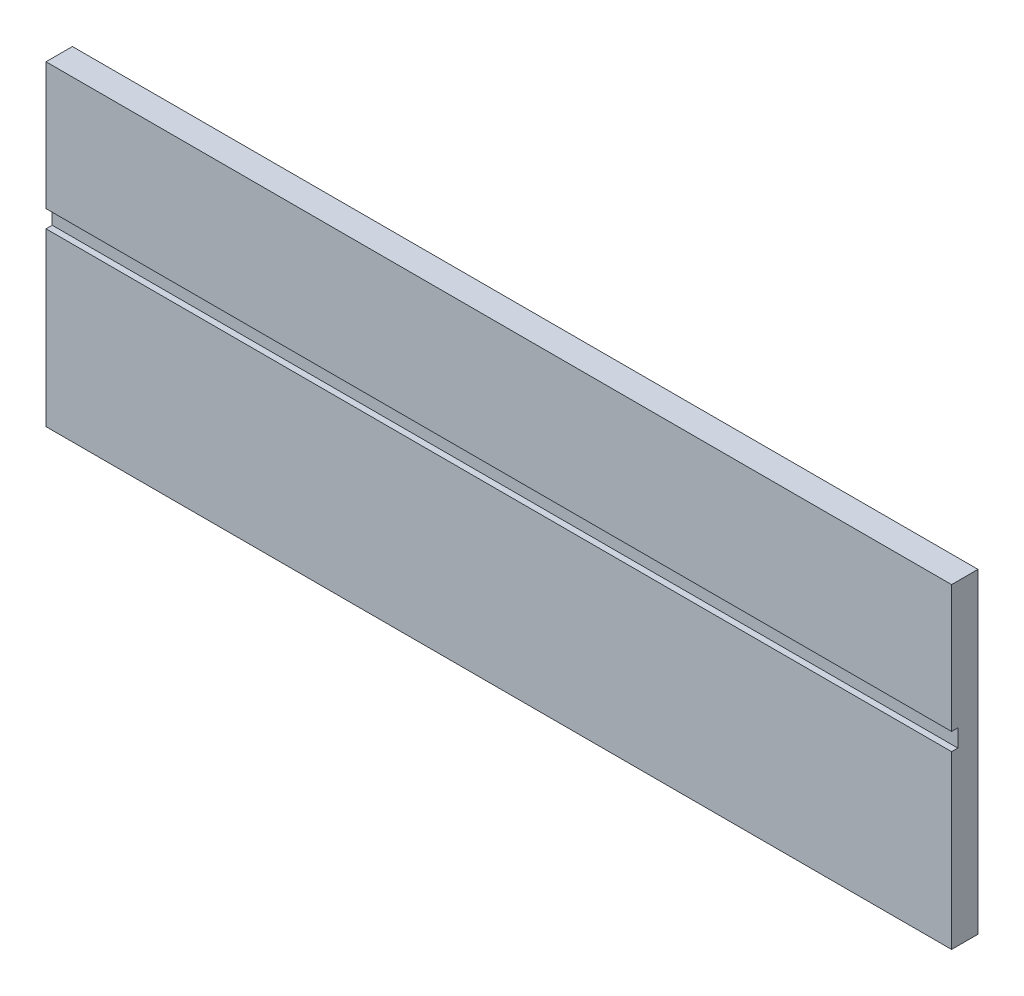
ISO-10303-21;
HEADER;
FILE_DESCRIPTION(('STEP AP214'),'2;1');
FILE_NAME('part.step','',(''),(''),'','','');
FILE_SCHEMA(('AUTOMOTIVE_DESIGN { 1 0 10303 214 1 1 1 1 }'));
ENDSEC;
DATA;
#1=APPLICATION_CONTEXT('core data for automotive mechanical design processes');
#2=APPLICATION_PROTOCOL_DEFINITION('international standard','automotive_design',2000,#1);
#3=PRODUCT_CONTEXT('',#1,'mechanical');
#4=PRODUCT('Part','Part','',(#3));
#5=PRODUCT_RELATED_PRODUCT_CATEGORY('part','',(#4));
#6=PRODUCT_DEFINITION_FORMATION('','',#4);
#7=PRODUCT_DEFINITION_CONTEXT('part definition',#1,'design');
#8=PRODUCT_DEFINITION('design','',#6,#7);
#9=PRODUCT_DEFINITION_SHAPE('','',#8);
#10=(LENGTH_UNIT() NAMED_UNIT(*) SI_UNIT(.MILLI.,.METRE.));
#11=(NAMED_UNIT(*) PLANE_ANGLE_UNIT() SI_UNIT($,.RADIAN.));
#12=(NAMED_UNIT(*) SI_UNIT($,.STERADIAN.) SOLID_ANGLE_UNIT());
#13=UNCERTAINTY_MEASURE_WITH_UNIT(LENGTH_MEASURE(1.E-05),#10,'distance_accuracy_value','');
#14=(GEOMETRIC_REPRESENTATION_CONTEXT(3) GLOBAL_UNCERTAINTY_ASSIGNED_CONTEXT((#13)) GLOBAL_UNIT_ASSIGNED_CONTEXT((#10,
#11,#12)) REPRESENTATION_CONTEXT('',''));
#15=CARTESIAN_POINT('',(0.,0.,0.));
#16=DIRECTION('',(0.,0.,1.));
#17=DIRECTION('',(1.,0.,0.));
#18=AXIS2_PLACEMENT_3D('',#15,#16,#17);
#19=CARTESIAN_POINT('',(137.16,-5794.375,0.));
#20=DIRECTION('',(0.,0.,1.));
#21=DIRECTION('',(1.,0.,0.));
#22=AXIS2_PLACEMENT_3D('',#19,#20,#21);
#23=PLANE('',#22);
#24=DIRECTION('',(-1.,0.,0.));
#25=VECTOR('',#24,1.);
#26=CARTESIAN_POINT('',(-603.25,-5639.9938,0.));
#27=LINE('',#26,#25);
#28=CARTESIAN_POINT('',(137.16,-5639.9938,0.));
#29=VERTEX_POINT('',#28);
#30=CARTESIAN_POINT('',(-603.25,-5639.9938,0.));
#31=VERTEX_POINT('',#30);
#32=EDGE_CURVE('E121',#29,#31,#27,.T.);
#33=ORIENTED_EDGE('',*,*,#32,.F.);
#34=DIRECTION('',(0.,1.,0.));
#35=VECTOR('',#34,1.);
#36=CARTESIAN_POINT('',(137.16,-5794.375,0.));
#37=LINE('',#36,#35);
#38=CARTESIAN_POINT('',(137.16,-5536.0062,0.));
#39=VERTEX_POINT('',#38);
#40=EDGE_CURVE('E143',#29,#39,#37,.T.);
#41=ORIENTED_EDGE('',*,*,#40,.T.);
#42=DIRECTION('',(-1.,0.,0.));
#43=VECTOR('',#42,1.);
#44=CARTESIAN_POINT('',(137.16,-5536.0062,0.));
#45=LINE('',#44,#43);
#46=CARTESIAN_POINT('',(-603.25,-5536.0062,0.));
#47=VERTEX_POINT('',#46);
#48=EDGE_CURVE('E148',#39,#47,#45,.T.);
#49=ORIENTED_EDGE('',*,*,#48,.T.);
#50=DIRECTION('',(0.,-1.,0.));
#51=VECTOR('',#50,1.);
#52=CARTESIAN_POINT('',(-603.25,-5536.0062,0.));
#53=LINE('',#52,#51);
#54=EDGE_CURVE('E133',#47,#31,#53,.T.);
#55=ORIENTED_EDGE('',*,*,#54,.T.);
#56=EDGE_LOOP('',(#33,#41,#49,#55));
#57=FACE_BOUND('',#56,.T.);
#58=ADVANCED_FACE('F31',(#57),#23,.T.);
#59=CARTESIAN_POINT('',(-603.25,-5794.375,-21.59));
#60=DIRECTION('',(0.,-1.,0.));
#61=DIRECTION('',(0.,0.,-1.));
#62=AXIS2_PLACEMENT_3D('',#59,#60,#61);
#63=PLANE('',#62);
#64=DIRECTION('',(1.,0.,0.));
#65=VECTOR('',#64,1.);
#66=CARTESIAN_POINT('',(-603.25,-5794.375,0.));
#67=LINE('',#66,#65);
#68=CARTESIAN_POINT('',(-603.25,-5794.375,0.));
#69=VERTEX_POINT('',#68);
#70=CARTESIAN_POINT('',(137.16,-5794.375,0.));
#71=VERTEX_POINT('',#70);
#72=EDGE_CURVE('E141',#69,#71,#67,.T.);
#73=ORIENTED_EDGE('',*,*,#72,.F.);
#74=DIRECTION('',(0.,0.,1.));
#75=VECTOR('',#74,1.);
#76=CARTESIAN_POINT('',(-603.25,-5794.375,-21.59));
#77=LINE('',#76,#75);
#78=CARTESIAN_POINT('',(-603.25,-5794.375,-21.59));
#79=VERTEX_POINT('',#78);
#80=EDGE_CURVE('E11',#79,#69,#77,.T.);
#81=ORIENTED_EDGE('',*,*,#80,.F.);
#82=DIRECTION('',(1.,0.,0.));
#83=VECTOR('',#82,1.);
#84=CARTESIAN_POINT('',(-603.25,-5794.375,-21.59));
#85=LINE('',#84,#83);
#86=CARTESIAN_POINT('',(137.16,-5794.375,-21.59));
#87=VERTEX_POINT('',#86);
#88=EDGE_CURVE('E130',#79,#87,#85,.T.);
#89=ORIENTED_EDGE('',*,*,#88,.T.);
#90=DIRECTION('',(0.,0.,1.));
#91=VECTOR('',#90,1.);
#92=CARTESIAN_POINT('',(137.16,-5794.375,-21.59));
#93=LINE('',#92,#91);
#94=EDGE_CURVE('E35',#87,#71,#93,.T.);
#95=ORIENTED_EDGE('',*,*,#94,.T.);
#96=EDGE_LOOP('',(#73,#81,#89,#95));
#97=FACE_BOUND('',#96,.T.);
#98=ADVANCED_FACE('F33',(#97),#63,.T.);
#99=CARTESIAN_POINT('',(-603.25,-5536.0062,-21.59));
#100=DIRECTION('',(-1.,0.,0.));
#101=DIRECTION('',(0.,0.,1.));
#102=AXIS2_PLACEMENT_3D('',#99,#100,#101);
#103=PLANE('',#102);
#104=DIRECTION('',(0.,0.,1.));
#105=VECTOR('',#104,1.);
#106=CARTESIAN_POINT('',(-603.25,-5639.9938,-5.08));
#107=LINE('',#106,#105);
#108=CARTESIAN_POINT('',(-603.25,-5639.9938,-5.08));
#109=VERTEX_POINT('',#108);
#110=EDGE_CURVE('E144',#109,#31,#107,.T.);
#111=ORIENTED_EDGE('',*,*,#110,.T.);
#112=ORIENTED_EDGE('',*,*,#54,.F.);
#113=DIRECTION('',(0.,0.,1.));
#114=VECTOR('',#113,1.);
#115=CARTESIAN_POINT('',(-603.25,-5536.0062,-21.59));
#116=LINE('',#115,#114);
#117=CARTESIAN_POINT('',(-603.25,-5536.0062,-21.59));
#118=VERTEX_POINT('',#117);
#119=EDGE_CURVE('E40',#118,#47,#116,.T.);
#120=ORIENTED_EDGE('',*,*,#119,.F.);
#121=DIRECTION('',(0.,-1.,0.));
#122=VECTOR('',#121,1.);
#123=CARTESIAN_POINT('',(-603.25,-5536.0062,-21.59));
#124=LINE('',#123,#122);
#125=EDGE_CURVE('E138',#118,#79,#124,.T.);
#126=ORIENTED_EDGE('',*,*,#125,.T.);
#127=ORIENTED_EDGE('',*,*,#80,.T.);
#128=CARTESIAN_POINT('',(-603.25,-5654.294,0.));
#129=VERTEX_POINT('',#128);
#130=EDGE_CURVE('E77',#129,#69,#53,.T.);
#131=ORIENTED_EDGE('',*,*,#130,.F.);
#132=DIRECTION('',(0.,0.,1.));
#133=VECTOR('',#132,1.);
#134=CARTESIAN_POINT('',(-603.25,-5654.294,-5.08));
#135=LINE('',#134,#133);
#136=CARTESIAN_POINT('',(-603.25,-5654.294,-5.08));
#137=VERTEX_POINT('',#136);
#138=EDGE_CURVE('E48',#137,#129,#135,.T.);
#139=ORIENTED_EDGE('',*,*,#138,.F.);
#140=DIRECTION('',(0.,-1.,0.));
#141=VECTOR('',#140,1.);
#142=CARTESIAN_POINT('',(-603.25,-5654.294,-5.08));
#143=LINE('',#142,#141);
#144=EDGE_CURVE('E112',#109,#137,#143,.T.);
#145=ORIENTED_EDGE('',*,*,#144,.F.);
#146=EDGE_LOOP('',(#111,#112,#120,#126,#127,#131,#139,#145));
#147=FACE_BOUND('',#146,.T.);
#148=ADVANCED_FACE('F123',(#147),#103,.T.);
#149=CARTESIAN_POINT('',(137.16,-5536.0062,-21.59));
#150=DIRECTION('',(0.,1.,0.));
#151=DIRECTION('',(0.,0.,1.));
#152=AXIS2_PLACEMENT_3D('',#149,#150,#151);
#153=PLANE('',#152);
#154=ORIENTED_EDGE('',*,*,#48,.F.);
#155=DIRECTION('',(0.,0.,1.));
#156=VECTOR('',#155,1.);
#157=CARTESIAN_POINT('',(137.16,-5536.0062,-21.59));
#158=LINE('',#157,#156);
#159=CARTESIAN_POINT('',(137.16,-5536.0062,-21.59));
#160=VERTEX_POINT('',#159);
#161=EDGE_CURVE('E153',#160,#39,#158,.T.);
#162=ORIENTED_EDGE('',*,*,#161,.F.);
#163=DIRECTION('',(-1.,0.,0.));
#164=VECTOR('',#163,1.);
#165=CARTESIAN_POINT('',(137.16,-5536.0062,-21.59));
#166=LINE('',#165,#164);
#167=EDGE_CURVE('E135',#160,#118,#166,.T.);
#168=ORIENTED_EDGE('',*,*,#167,.T.);
#169=ORIENTED_EDGE('',*,*,#119,.T.);
#170=EDGE_LOOP('',(#154,#162,#168,#169));
#171=FACE_BOUND('',#170,.T.);
#172=ADVANCED_FACE('F188',(#171),#153,.T.);
#173=CARTESIAN_POINT('',(137.16,-5794.375,-21.59));
#174=DIRECTION('',(1.,0.,0.));
#175=DIRECTION('',(0.,0.,-1.));
#176=AXIS2_PLACEMENT_3D('',#173,#174,#175);
#177=PLANE('',#176);
#178=DIRECTION('',(0.,0.,1.));
#179=VECTOR('',#178,1.);
#180=CARTESIAN_POINT('',(137.16,-5639.9938,-5.08));
#181=LINE('',#180,#179);
#182=CARTESIAN_POINT('',(137.16,-5639.9938,-5.08));
#183=VERTEX_POINT('',#182);
#184=EDGE_CURVE('E125',#183,#29,#181,.T.);
#185=ORIENTED_EDGE('',*,*,#184,.F.);
#186=DIRECTION('',(0.,1.,0.));
#187=VECTOR('',#186,1.);
#188=CARTESIAN_POINT('',(137.16,-5639.9938,-5.08));
#189=LINE('',#188,#187);
#190=CARTESIAN_POINT('',(137.16,-5654.294,-5.08));
#191=VERTEX_POINT('',#190);
#192=EDGE_CURVE('E111',#191,#183,#189,.T.);
#193=ORIENTED_EDGE('',*,*,#192,.F.);
#194=DIRECTION('',(0.,0.,1.));
#195=VECTOR('',#194,1.);
#196=CARTESIAN_POINT('',(137.16,-5654.294,-5.08));
#197=LINE('',#196,#195);
#198=CARTESIAN_POINT('',(137.16,-5654.294,0.));
#199=VERTEX_POINT('',#198);
#200=EDGE_CURVE('E108',#191,#199,#197,.T.);
#201=ORIENTED_EDGE('',*,*,#200,.T.);
#202=EDGE_CURVE('E145',#71,#199,#37,.T.);
#203=ORIENTED_EDGE('',*,*,#202,.F.);
#204=ORIENTED_EDGE('',*,*,#94,.F.);
#205=DIRECTION('',(0.,1.,0.));
#206=VECTOR('',#205,1.);
#207=CARTESIAN_POINT('',(137.16,-5794.375,-21.59));
#208=LINE('',#207,#206);
#209=EDGE_CURVE('E132',#87,#160,#208,.T.);
#210=ORIENTED_EDGE('',*,*,#209,.T.);
#211=ORIENTED_EDGE('',*,*,#161,.T.);
#212=ORIENTED_EDGE('',*,*,#40,.F.);
#213=EDGE_LOOP('',(#185,#193,#201,#203,#204,#210,#211,#212));
#214=FACE_BOUND('',#213,.T.);
#215=ADVANCED_FACE('F158',(#214),#177,.T.);
#216=CARTESIAN_POINT('',(137.16,-5794.375,-21.59));
#217=DIRECTION('',(0.,0.,1.));
#218=DIRECTION('',(1.,0.,0.));
#219=AXIS2_PLACEMENT_3D('',#216,#217,#218);
#220=PLANE('',#219);
#221=ORIENTED_EDGE('',*,*,#88,.F.);
#222=ORIENTED_EDGE('',*,*,#125,.F.);
#223=ORIENTED_EDGE('',*,*,#167,.F.);
#224=ORIENTED_EDGE('',*,*,#209,.F.);
#225=EDGE_LOOP('',(#221,#222,#223,#224));
#226=FACE_BOUND('',#225,.T.);
#227=ADVANCED_FACE('F163',(#226),#220,.F.);
#228=DIRECTION('',(1.,0.,0.));
#229=VECTOR('',#228,1.);
#230=CARTESIAN_POINT('',(137.16,-5654.294,0.));
#231=LINE('',#230,#229);
#232=EDGE_CURVE('E160',#129,#199,#231,.T.);
#233=ORIENTED_EDGE('',*,*,#232,.F.);
#234=ORIENTED_EDGE('',*,*,#130,.T.);
#235=ORIENTED_EDGE('',*,*,#72,.T.);
#236=ORIENTED_EDGE('',*,*,#202,.T.);
#237=EDGE_LOOP('',(#233,#234,#235,#236));
#238=FACE_BOUND('',#237,.T.);
#239=ADVANCED_FACE('F159',(#238),#23,.T.);
#240=CARTESIAN_POINT('',(-603.25,-5639.9938,-5.08));
#241=DIRECTION('',(0.,1.,0.));
#242=DIRECTION('',(0.,0.,1.));
#243=AXIS2_PLACEMENT_3D('',#240,#241,#242);
#244=PLANE('',#243);
#245=ORIENTED_EDGE('',*,*,#32,.T.);
#246=ORIENTED_EDGE('',*,*,#110,.F.);
#247=DIRECTION('',(-1.,0.,0.));
#248=VECTOR('',#247,1.);
#249=CARTESIAN_POINT('',(-603.25,-5639.9938,-5.08));
#250=LINE('',#249,#248);
#251=EDGE_CURVE('E118',#183,#109,#250,.T.);
#252=ORIENTED_EDGE('',*,*,#251,.F.);
#253=ORIENTED_EDGE('',*,*,#184,.T.);
#254=EDGE_LOOP('',(#245,#246,#252,#253));
#255=FACE_BOUND('',#254,.T.);
#256=ADVANCED_FACE('F162',(#255),#244,.F.);
#257=CARTESIAN_POINT('',(137.16,-5654.294,-5.08));
#258=DIRECTION('',(0.,-1.,0.));
#259=DIRECTION('',(0.,0.,-1.));
#260=AXIS2_PLACEMENT_3D('',#257,#258,#259);
#261=PLANE('',#260);
#262=ORIENTED_EDGE('',*,*,#232,.T.);
#263=ORIENTED_EDGE('',*,*,#200,.F.);
#264=DIRECTION('',(1.,0.,0.));
#265=VECTOR('',#264,1.);
#266=CARTESIAN_POINT('',(137.16,-5654.294,-5.08));
#267=LINE('',#266,#265);
#268=EDGE_CURVE('E104',#137,#191,#267,.T.);
#269=ORIENTED_EDGE('',*,*,#268,.F.);
#270=ORIENTED_EDGE('',*,*,#138,.T.);
#271=EDGE_LOOP('',(#262,#263,#269,#270));
#272=FACE_BOUND('',#271,.T.);
#273=ADVANCED_FACE('F106',(#272),#261,.F.);
#274=CARTESIAN_POINT('',(-603.25,-5639.9938,-5.08));
#275=DIRECTION('',(0.,0.,-1.));
#276=DIRECTION('',(-1.,0.,0.));
#277=AXIS2_PLACEMENT_3D('',#274,#275,#276);
#278=PLANE('',#277);
#279=ORIENTED_EDGE('',*,*,#144,.T.);
#280=ORIENTED_EDGE('',*,*,#268,.T.);
#281=ORIENTED_EDGE('',*,*,#192,.T.);
#282=ORIENTED_EDGE('',*,*,#251,.T.);
#283=EDGE_LOOP('',(#279,#280,#281,#282));
#284=FACE_BOUND('',#283,.T.);
#285=ADVANCED_FACE('F116',(#284),#278,.F.);
#286=CLOSED_SHELL('',(#58,#98,#148,#172,#215,#227,#239,#256,#273,#285));
#287=MANIFOLD_SOLID_BREP('B2',#286);
#288=ADVANCED_BREP_SHAPE_REPRESENTATION('',(#18,#287),#14);
#289=SHAPE_DEFINITION_REPRESENTATION(#9,#288);
ENDSEC;
END-ISO-10303-21;
